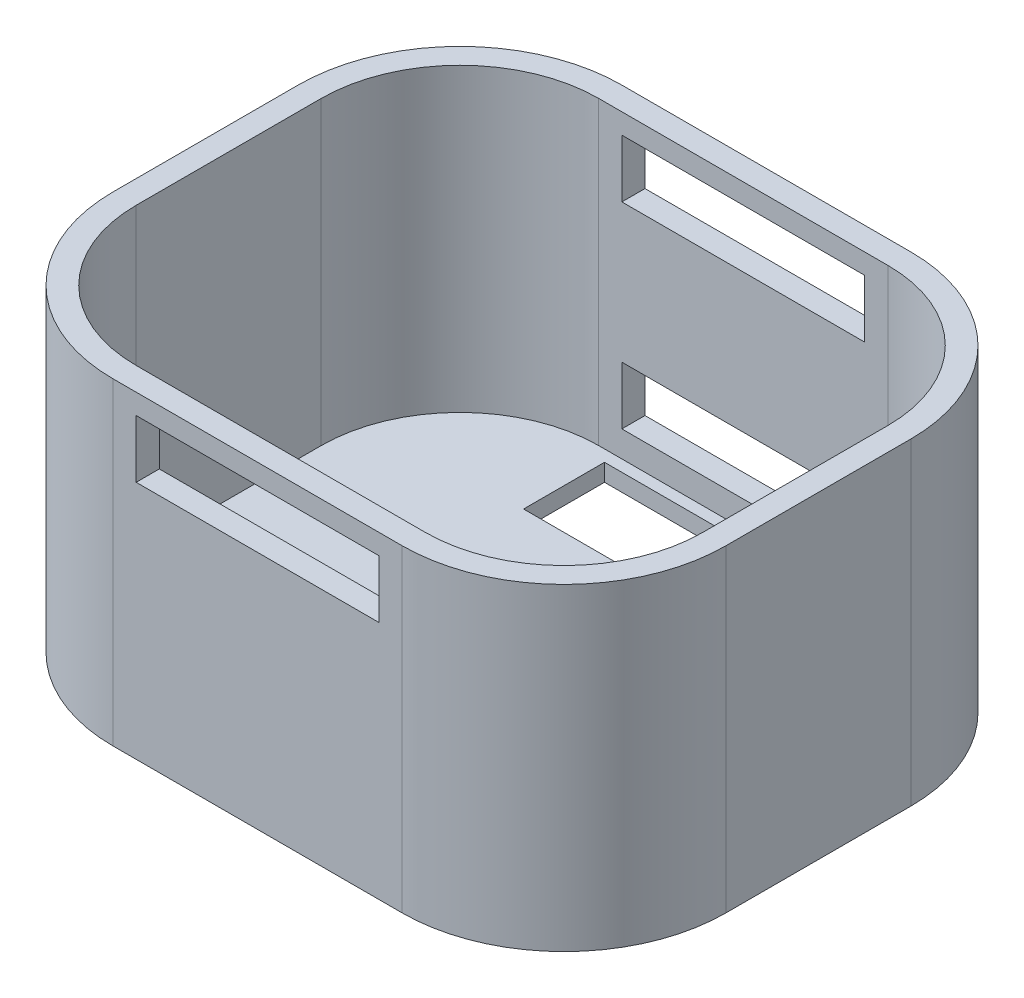
ISO-10303-21;
HEADER;
FILE_DESCRIPTION(('STEP AP214'),'2;1');
FILE_NAME('part.step','',(''),(''),'','','');
FILE_SCHEMA(('AUTOMOTIVE_DESIGN { 1 0 10303 214 1 1 1 1 }'));
ENDSEC;
DATA;
#1=APPLICATION_CONTEXT('core data for automotive mechanical design processes');
#2=APPLICATION_PROTOCOL_DEFINITION('international standard','automotive_design',2000,#1);
#3=PRODUCT_CONTEXT('',#1,'mechanical');
#4=PRODUCT('Part','Part','',(#3));
#5=PRODUCT_RELATED_PRODUCT_CATEGORY('part','',(#4));
#6=PRODUCT_DEFINITION_FORMATION('','',#4);
#7=PRODUCT_DEFINITION_CONTEXT('part definition',#1,'design');
#8=PRODUCT_DEFINITION('design','',#6,#7);
#9=PRODUCT_DEFINITION_SHAPE('','',#8);
#10=(LENGTH_UNIT() NAMED_UNIT(*) SI_UNIT(.MILLI.,.METRE.));
#11=(NAMED_UNIT(*) PLANE_ANGLE_UNIT() SI_UNIT($,.RADIAN.));
#12=(NAMED_UNIT(*) SI_UNIT($,.STERADIAN.) SOLID_ANGLE_UNIT());
#13=UNCERTAINTY_MEASURE_WITH_UNIT(LENGTH_MEASURE(1.E-05),#10,'distance_accuracy_value','');
#14=(GEOMETRIC_REPRESENTATION_CONTEXT(3) GLOBAL_UNCERTAINTY_ASSIGNED_CONTEXT((#13)) GLOBAL_UNIT_ASSIGNED_CONTEXT((#10,
#11,#12)) REPRESENTATION_CONTEXT('',''));
#15=CARTESIAN_POINT('',(0.,0.,0.));
#16=DIRECTION('',(0.,0.,1.));
#17=DIRECTION('',(1.,0.,0.));
#18=AXIS2_PLACEMENT_3D('',#15,#16,#17);
#19=CARTESIAN_POINT('',(12.5,13.75,-7.99999999999999));
#20=DIRECTION('',(0.,-1.,0.));
#21=DIRECTION('',(0.,0.,-1.));
#22=AXIS2_PLACEMENT_3D('',#19,#20,#21);
#23=CYLINDRICAL_SURFACE('',#22,12.);
#24=DIRECTION('',(0.,-1.,0.));
#25=VECTOR('',#24,1.);
#26=CARTESIAN_POINT('',(12.5,13.75,-20.));
#27=LINE('',#26,#25);
#28=CARTESIAN_POINT('',(12.5,13.75,-20.));
#29=VERTEX_POINT('',#28);
#30=CARTESIAN_POINT('',(12.5,-12.25,-20.));
#31=VERTEX_POINT('',#30);
#32=EDGE_CURVE('E417',#29,#31,#27,.T.);
#33=ORIENTED_EDGE('',*,*,#32,.T.);
#34=CARTESIAN_POINT('',(12.5,-12.25,-7.99999999999999));
#35=DIRECTION('',(0.,-1.,0.));
#36=DIRECTION('',(0.,0.,-1.));
#37=AXIS2_PLACEMENT_3D('',#34,#35,#36);
#38=CIRCLE('',#37,12.);
#39=CARTESIAN_POINT('',(24.5,-12.25,-7.99999999999999));
#40=VERTEX_POINT('',#39);
#41=EDGE_CURVE('E329',#31,#40,#38,.T.);
#42=ORIENTED_EDGE('',*,*,#41,.T.);
#43=DIRECTION('',(0.,-1.,0.));
#44=VECTOR('',#43,1.);
#45=CARTESIAN_POINT('',(24.5,13.75,-7.99999999999999));
#46=LINE('',#45,#44);
#47=CARTESIAN_POINT('',(24.5,13.75,-7.99999999999999));
#48=VERTEX_POINT('',#47);
#49=EDGE_CURVE('E396',#48,#40,#46,.T.);
#50=ORIENTED_EDGE('',*,*,#49,.F.);
#51=CARTESIAN_POINT('',(12.5,13.75,-7.99999999999999));
#52=DIRECTION('',(0.,1.,0.));
#53=DIRECTION('',(0.,0.,-1.));
#54=AXIS2_PLACEMENT_3D('',#51,#52,#53);
#55=CIRCLE('',#54,12.);
#56=EDGE_CURVE('E379',#48,#29,#55,.T.);
#57=ORIENTED_EDGE('',*,*,#56,.T.);
#58=EDGE_LOOP('',(#33,#42,#50,#57));
#59=FACE_BOUND('',#58,.T.);
#60=ADVANCED_FACE('F33',(#59),#23,.F.);
#61=CARTESIAN_POINT('',(12.5,13.75,-20.));
#62=DIRECTION('',(0.,0.,1.));
#63=DIRECTION('',(1.,0.,0.));
#64=AXIS2_PLACEMENT_3D('',#61,#62,#63);
#65=PLANE('',#64);
#66=DIRECTION('',(0.,1.,0.));
#67=VECTOR('',#66,1.);
#68=CARTESIAN_POINT('',(-10.5,-5.,-20.));
#69=LINE('',#68,#67);
#70=CARTESIAN_POINT('',(-10.5,-10.,-20.));
#71=VERTEX_POINT('',#70);
#72=CARTESIAN_POINT('',(-10.5,-5.,-20.));
#73=VERTEX_POINT('',#72);
#74=EDGE_CURVE('E280',#71,#73,#69,.T.);
#75=ORIENTED_EDGE('',*,*,#74,.T.);
#76=DIRECTION('',(1.,0.,0.));
#77=VECTOR('',#76,1.);
#78=CARTESIAN_POINT('',(10.5,-5.,-20.));
#79=LINE('',#78,#77);
#80=CARTESIAN_POINT('',(10.5,-5.,-20.));
#81=VERTEX_POINT('',#80);
#82=EDGE_CURVE('E283',#73,#81,#79,.T.);
#83=ORIENTED_EDGE('',*,*,#82,.T.);
#84=DIRECTION('',(0.,-1.,0.));
#85=VECTOR('',#84,1.);
#86=CARTESIAN_POINT('',(10.5,-5.,-20.));
#87=LINE('',#86,#85);
#88=CARTESIAN_POINT('',(10.5,-10.,-20.));
#89=VERTEX_POINT('',#88);
#90=EDGE_CURVE('E287',#81,#89,#87,.T.);
#91=ORIENTED_EDGE('',*,*,#90,.T.);
#92=DIRECTION('',(-1.,0.,0.));
#93=VECTOR('',#92,1.);
#94=CARTESIAN_POINT('',(10.5,-10.,-20.));
#95=LINE('',#94,#93);
#96=EDGE_CURVE('E290',#89,#71,#95,.T.);
#97=ORIENTED_EDGE('',*,*,#96,.T.);
#98=EDGE_LOOP('',(#75,#83,#91,#97));
#99=FACE_BOUND('',#98,.T.);
#100=DIRECTION('',(0.,1.,0.));
#101=VECTOR('',#100,1.);
#102=CARTESIAN_POINT('',(10.5,13.75,-20.));
#103=LINE('',#102,#101);
#104=CARTESIAN_POINT('',(10.5,7.,-20.));
#105=VERTEX_POINT('',#104);
#106=CARTESIAN_POINT('',(10.5,12.,-20.));
#107=VERTEX_POINT('',#106);
#108=EDGE_CURVE('E376',#105,#107,#103,.T.);
#109=ORIENTED_EDGE('',*,*,#108,.F.);
#110=DIRECTION('',(1.,0.,0.));
#111=VECTOR('',#110,1.);
#112=CARTESIAN_POINT('',(12.5,7.,-20.));
#113=LINE('',#112,#111);
#114=CARTESIAN_POINT('',(-10.5,7.,-20.));
#115=VERTEX_POINT('',#114);
#116=EDGE_CURVE('E374',#115,#105,#113,.T.);
#117=ORIENTED_EDGE('',*,*,#116,.F.);
#118=DIRECTION('',(0.,-1.,0.));
#119=VECTOR('',#118,1.);
#120=CARTESIAN_POINT('',(-10.5,13.75,-20.));
#121=LINE('',#120,#119);
#122=CARTESIAN_POINT('',(-10.5,12.,-20.));
#123=VERTEX_POINT('',#122);
#124=EDGE_CURVE('E372',#123,#115,#121,.T.);
#125=ORIENTED_EDGE('',*,*,#124,.F.);
#126=DIRECTION('',(-1.,0.,0.));
#127=VECTOR('',#126,1.);
#128=CARTESIAN_POINT('',(12.5,12.,-20.));
#129=LINE('',#128,#127);
#130=EDGE_CURVE('E359',#107,#123,#129,.T.);
#131=ORIENTED_EDGE('',*,*,#130,.F.);
#132=EDGE_LOOP('',(#109,#117,#125,#131));
#133=FACE_BOUND('',#132,.T.);
#134=DIRECTION('',(0.,-1.,0.));
#135=VECTOR('',#134,1.);
#136=CARTESIAN_POINT('',(-12.5,13.75,-20.));
#137=LINE('',#136,#135);
#138=CARTESIAN_POINT('',(-12.5,13.75,-20.));
#139=VERTEX_POINT('',#138);
#140=CARTESIAN_POINT('',(-12.5,-12.25,-20.));
#141=VERTEX_POINT('',#140);
#142=EDGE_CURVE('E414',#139,#141,#137,.T.);
#143=ORIENTED_EDGE('',*,*,#142,.T.);
#144=DIRECTION('',(1.,0.,0.));
#145=VECTOR('',#144,1.);
#146=CARTESIAN_POINT('',(12.5,-12.25,-20.));
#147=LINE('',#146,#145);
#148=EDGE_CURVE('E326',#141,#31,#147,.T.);
#149=ORIENTED_EDGE('',*,*,#148,.T.);
#150=ORIENTED_EDGE('',*,*,#32,.F.);
#151=DIRECTION('',(-1.,0.,0.));
#152=VECTOR('',#151,1.);
#153=CARTESIAN_POINT('',(12.5,13.75,-20.));
#154=LINE('',#153,#152);
#155=EDGE_CURVE('E381',#29,#139,#154,.T.);
#156=ORIENTED_EDGE('',*,*,#155,.T.);
#157=EDGE_LOOP('',(#143,#149,#150,#156));
#158=FACE_BOUND('',#157,.T.);
#159=ADVANCED_FACE('F525',(#99,#133,#158),#65,.T.);
#160=CARTESIAN_POINT('',(-12.5,13.75,-7.99999999999999));
#161=DIRECTION('',(0.,-1.,0.));
#162=DIRECTION('',(0.,0.,-1.));
#163=AXIS2_PLACEMENT_3D('',#160,#161,#162);
#164=CYLINDRICAL_SURFACE('',#163,12.);
#165=DIRECTION('',(0.,-1.,0.));
#166=VECTOR('',#165,1.);
#167=CARTESIAN_POINT('',(-24.5,13.75,-7.99999999999999));
#168=LINE('',#167,#166);
#169=CARTESIAN_POINT('',(-24.5,13.75,-7.99999999999999));
#170=VERTEX_POINT('',#169);
#171=CARTESIAN_POINT('',(-24.5,-12.25,-7.99999999999999));
#172=VERTEX_POINT('',#171);
#173=EDGE_CURVE('E411',#170,#172,#168,.T.);
#174=ORIENTED_EDGE('',*,*,#173,.T.);
#175=CARTESIAN_POINT('',(-12.5,-12.25,-7.99999999999999));
#176=DIRECTION('',(0.,-1.,0.));
#177=DIRECTION('',(0.,0.,-1.));
#178=AXIS2_PLACEMENT_3D('',#175,#176,#177);
#179=CIRCLE('',#178,12.);
#180=EDGE_CURVE('E323',#172,#141,#179,.T.);
#181=ORIENTED_EDGE('',*,*,#180,.T.);
#182=ORIENTED_EDGE('',*,*,#142,.F.);
#183=CARTESIAN_POINT('',(-12.5,13.75,-7.99999999999999));
#184=DIRECTION('',(0.,1.,0.));
#185=DIRECTION('',(0.,0.,-1.));
#186=AXIS2_PLACEMENT_3D('',#183,#184,#185);
#187=CIRCLE('',#186,12.);
#188=EDGE_CURVE('E383',#139,#170,#187,.T.);
#189=ORIENTED_EDGE('',*,*,#188,.T.);
#190=EDGE_LOOP('',(#174,#181,#182,#189));
#191=FACE_BOUND('',#190,.T.);
#192=ADVANCED_FACE('F531',(#191),#164,.F.);
#193=CARTESIAN_POINT('',(-24.5,13.75,8.00000000000001));
#194=DIRECTION('',(1.,0.,0.));
#195=DIRECTION('',(0.,0.,-1.));
#196=AXIS2_PLACEMENT_3D('',#193,#194,#195);
#197=PLANE('',#196);
#198=DIRECTION('',(0.,-1.,0.));
#199=VECTOR('',#198,1.);
#200=CARTESIAN_POINT('',(-24.5,13.75,8.00000000000001));
#201=LINE('',#200,#199);
#202=CARTESIAN_POINT('',(-24.5,13.75,8.00000000000001));
#203=VERTEX_POINT('',#202);
#204=CARTESIAN_POINT('',(-24.5,-12.25,8.00000000000001));
#205=VERTEX_POINT('',#204);
#206=EDGE_CURVE('E408',#203,#205,#201,.T.);
#207=ORIENTED_EDGE('',*,*,#206,.T.);
#208=DIRECTION('',(0.,0.,-1.));
#209=VECTOR('',#208,1.);
#210=CARTESIAN_POINT('',(-24.5,-12.25,8.00000000000001));
#211=LINE('',#210,#209);
#212=EDGE_CURVE('E320',#205,#172,#211,.T.);
#213=ORIENTED_EDGE('',*,*,#212,.T.);
#214=ORIENTED_EDGE('',*,*,#173,.F.);
#215=DIRECTION('',(0.,0.,1.));
#216=VECTOR('',#215,1.);
#217=CARTESIAN_POINT('',(-24.5,13.75,8.00000000000001));
#218=LINE('',#217,#216);
#219=EDGE_CURVE('E385',#170,#203,#218,.T.);
#220=ORIENTED_EDGE('',*,*,#219,.T.);
#221=EDGE_LOOP('',(#207,#213,#214,#220));
#222=FACE_BOUND('',#221,.T.);
#223=ADVANCED_FACE('F623',(#222),#197,.T.);
#224=CARTESIAN_POINT('',(-12.5,13.75,8.00000000000001));
#225=DIRECTION('',(0.,-1.,0.));
#226=DIRECTION('',(0.,0.,-1.));
#227=AXIS2_PLACEMENT_3D('',#224,#225,#226);
#228=CYLINDRICAL_SURFACE('',#227,12.);
#229=DIRECTION('',(0.,-1.,0.));
#230=VECTOR('',#229,1.);
#231=CARTESIAN_POINT('',(-12.5,13.75,20.));
#232=LINE('',#231,#230);
#233=CARTESIAN_POINT('',(-12.5,13.75,20.));
#234=VERTEX_POINT('',#233);
#235=CARTESIAN_POINT('',(-12.5,-12.25,20.));
#236=VERTEX_POINT('',#235);
#237=EDGE_CURVE('E405',#234,#236,#232,.T.);
#238=ORIENTED_EDGE('',*,*,#237,.T.);
#239=CARTESIAN_POINT('',(-12.5,-12.25,8.00000000000001));
#240=DIRECTION('',(0.,-1.,0.));
#241=DIRECTION('',(0.,0.,-1.));
#242=AXIS2_PLACEMENT_3D('',#239,#240,#241);
#243=CIRCLE('',#242,12.);
#244=EDGE_CURVE('E317',#236,#205,#243,.T.);
#245=ORIENTED_EDGE('',*,*,#244,.T.);
#246=ORIENTED_EDGE('',*,*,#206,.F.);
#247=CARTESIAN_POINT('',(-12.5,13.75,8.00000000000001));
#248=DIRECTION('',(0.,1.,0.));
#249=DIRECTION('',(0.,0.,-1.));
#250=AXIS2_PLACEMENT_3D('',#247,#248,#249);
#251=CIRCLE('',#250,12.);
#252=EDGE_CURVE('E387',#203,#234,#251,.T.);
#253=ORIENTED_EDGE('',*,*,#252,.T.);
#254=EDGE_LOOP('',(#238,#245,#246,#253));
#255=FACE_BOUND('',#254,.T.);
#256=ADVANCED_FACE('F625',(#255),#228,.F.);
#257=CARTESIAN_POINT('',(12.5,13.75,20.));
#258=DIRECTION('',(0.,0.,-1.));
#259=DIRECTION('',(-1.,0.,0.));
#260=AXIS2_PLACEMENT_3D('',#257,#258,#259);
#261=PLANE('',#260);
#262=DIRECTION('',(0.,-1.,0.));
#263=VECTOR('',#262,1.);
#264=CARTESIAN_POINT('',(10.5,13.75,20.));
#265=LINE('',#264,#263);
#266=CARTESIAN_POINT('',(10.5,12.,20.));
#267=VERTEX_POINT('',#266);
#268=CARTESIAN_POINT('',(10.5,7.,20.));
#269=VERTEX_POINT('',#268);
#270=EDGE_CURVE('E41',#267,#269,#265,.T.);
#271=ORIENTED_EDGE('',*,*,#270,.F.);
#272=DIRECTION('',(1.,0.,0.));
#273=VECTOR('',#272,1.);
#274=CARTESIAN_POINT('',(12.5,12.,20.));
#275=LINE('',#274,#273);
#276=CARTESIAN_POINT('',(-10.5,12.,20.));
#277=VERTEX_POINT('',#276);
#278=EDGE_CURVE('E477',#277,#267,#275,.T.);
#279=ORIENTED_EDGE('',*,*,#278,.F.);
#280=DIRECTION('',(0.,1.,0.));
#281=VECTOR('',#280,1.);
#282=CARTESIAN_POINT('',(-10.5,13.75,20.));
#283=LINE('',#282,#281);
#284=CARTESIAN_POINT('',(-10.5,7.,20.));
#285=VERTEX_POINT('',#284);
#286=EDGE_CURVE('E479',#285,#277,#283,.T.);
#287=ORIENTED_EDGE('',*,*,#286,.F.);
#288=DIRECTION('',(-1.,0.,0.));
#289=VECTOR('',#288,1.);
#290=CARTESIAN_POINT('',(12.5,7.,20.));
#291=LINE('',#290,#289);
#292=EDGE_CURVE('E482',#269,#285,#291,.T.);
#293=ORIENTED_EDGE('',*,*,#292,.F.);
#294=EDGE_LOOP('',(#271,#279,#287,#293));
#295=FACE_BOUND('',#294,.T.);
#296=DIRECTION('',(0.,-1.,0.));
#297=VECTOR('',#296,1.);
#298=CARTESIAN_POINT('',(12.5,13.75,20.));
#299=LINE('',#298,#297);
#300=CARTESIAN_POINT('',(12.5,13.75,20.));
#301=VERTEX_POINT('',#300);
#302=CARTESIAN_POINT('',(12.5,-12.25,20.));
#303=VERTEX_POINT('',#302);
#304=EDGE_CURVE('E402',#301,#303,#299,.T.);
#305=ORIENTED_EDGE('',*,*,#304,.T.);
#306=DIRECTION('',(-1.,0.,0.));
#307=VECTOR('',#306,1.);
#308=CARTESIAN_POINT('',(12.5,-12.25,20.));
#309=LINE('',#308,#307);
#310=EDGE_CURVE('E314',#303,#236,#309,.T.);
#311=ORIENTED_EDGE('',*,*,#310,.T.);
#312=ORIENTED_EDGE('',*,*,#237,.F.);
#313=DIRECTION('',(1.,0.,0.));
#314=VECTOR('',#313,1.);
#315=CARTESIAN_POINT('',(12.5,13.75,20.));
#316=LINE('',#315,#314);
#317=EDGE_CURVE('E389',#234,#301,#316,.T.);
#318=ORIENTED_EDGE('',*,*,#317,.T.);
#319=EDGE_LOOP('',(#305,#311,#312,#318));
#320=FACE_BOUND('',#319,.T.);
#321=ADVANCED_FACE('F498',(#295,#320),#261,.T.);
#322=CARTESIAN_POINT('',(12.5,13.75,8.00000000000001));
#323=DIRECTION('',(0.,-1.,0.));
#324=DIRECTION('',(0.,0.,-1.));
#325=AXIS2_PLACEMENT_3D('',#322,#323,#324);
#326=CYLINDRICAL_SURFACE('',#325,12.);
#327=DIRECTION('',(0.,-1.,0.));
#328=VECTOR('',#327,1.);
#329=CARTESIAN_POINT('',(24.5,13.75,8.00000000000001));
#330=LINE('',#329,#328);
#331=CARTESIAN_POINT('',(24.5,13.75,8.));
#332=VERTEX_POINT('',#331);
#333=CARTESIAN_POINT('',(24.5,-12.25,8.00000000000001));
#334=VERTEX_POINT('',#333);
#335=EDGE_CURVE('E399',#332,#334,#330,.T.);
#336=ORIENTED_EDGE('',*,*,#335,.T.);
#337=CARTESIAN_POINT('',(12.5,-12.25,8.00000000000001));
#338=DIRECTION('',(0.,-1.,0.));
#339=DIRECTION('',(0.,0.,-1.));
#340=AXIS2_PLACEMENT_3D('',#337,#338,#339);
#341=CIRCLE('',#340,12.);
#342=EDGE_CURVE('E305',#334,#303,#341,.T.);
#343=ORIENTED_EDGE('',*,*,#342,.T.);
#344=ORIENTED_EDGE('',*,*,#304,.F.);
#345=CARTESIAN_POINT('',(12.5,13.75,8.00000000000001));
#346=DIRECTION('',(0.,1.,0.));
#347=DIRECTION('',(0.,0.,-1.));
#348=AXIS2_PLACEMENT_3D('',#345,#346,#347);
#349=CIRCLE('',#348,12.);
#350=EDGE_CURVE('E391',#301,#332,#349,.T.);
#351=ORIENTED_EDGE('',*,*,#350,.T.);
#352=EDGE_LOOP('',(#336,#343,#344,#351));
#353=FACE_BOUND('',#352,.T.);
#354=ADVANCED_FACE('F630',(#353),#326,.F.);
#355=CARTESIAN_POINT('',(24.5,13.75,8.00000000000001));
#356=DIRECTION('',(-1.,0.,0.));
#357=DIRECTION('',(0.,0.,1.));
#358=AXIS2_PLACEMENT_3D('',#355,#356,#357);
#359=PLANE('',#358);
#360=ORIENTED_EDGE('',*,*,#49,.T.);
#361=DIRECTION('',(0.,0.,1.));
#362=VECTOR('',#361,1.);
#363=CARTESIAN_POINT('',(24.5,-12.25,8.00000000000001));
#364=LINE('',#363,#362);
#365=EDGE_CURVE('E11',#40,#334,#364,.T.);
#366=ORIENTED_EDGE('',*,*,#365,.T.);
#367=ORIENTED_EDGE('',*,*,#335,.F.);
#368=DIRECTION('',(0.,0.,-1.));
#369=VECTOR('',#368,1.);
#370=CARTESIAN_POINT('',(24.5,13.75,8.00000000000001));
#371=LINE('',#370,#369);
#372=EDGE_CURVE('E394',#332,#48,#371,.T.);
#373=ORIENTED_EDGE('',*,*,#372,.T.);
#374=EDGE_LOOP('',(#360,#366,#367,#373));
#375=FACE_BOUND('',#374,.T.);
#376=ADVANCED_FACE('F540',(#375),#359,.T.);
#377=CARTESIAN_POINT('',(-12.5,13.75,-7.99999999999999));
#378=DIRECTION('',(0.,1.,0.));
#379=DIRECTION('',(0.,0.,1.));
#380=AXIS2_PLACEMENT_3D('',#377,#378,#379);
#381=PLANE('',#380);
#382=CARTESIAN_POINT('',(-12.5,13.75,-7.99999999999999));
#383=DIRECTION('',(0.,1.,0.));
#384=DIRECTION('',(0.,0.,1.));
#385=AXIS2_PLACEMENT_3D('',#382,#383,#384);
#386=CIRCLE('',#385,14.);
#387=CARTESIAN_POINT('',(-12.5,13.75,-22.));
#388=VERTEX_POINT('',#387);
#389=CARTESIAN_POINT('',(-26.5,13.75,-7.99999999999998));
#390=VERTEX_POINT('',#389);
#391=EDGE_CURVE('E421',#388,#390,#386,.T.);
#392=ORIENTED_EDGE('',*,*,#391,.T.);
#393=DIRECTION('',(0.,0.,1.));
#394=VECTOR('',#393,1.);
#395=CARTESIAN_POINT('',(-26.5,13.75,-7.99999999999998));
#396=LINE('',#395,#394);
#397=CARTESIAN_POINT('',(-26.5,13.75,7.99999999999998));
#398=VERTEX_POINT('',#397);
#399=EDGE_CURVE('E424',#390,#398,#396,.T.);
#400=ORIENTED_EDGE('',*,*,#399,.T.);
#401=CARTESIAN_POINT('',(-12.5,13.75,7.99999999999998));
#402=DIRECTION('',(0.,1.,0.));
#403=DIRECTION('',(0.,0.,1.));
#404=AXIS2_PLACEMENT_3D('',#401,#402,#403);
#405=CIRCLE('',#404,14.);
#406=CARTESIAN_POINT('',(-12.5,13.75,22.));
#407=VERTEX_POINT('',#406);
#408=EDGE_CURVE('E427',#398,#407,#405,.T.);
#409=ORIENTED_EDGE('',*,*,#408,.T.);
#410=DIRECTION('',(1.,0.,0.));
#411=VECTOR('',#410,1.);
#412=CARTESIAN_POINT('',(-12.5,13.75,22.));
#413=LINE('',#412,#411);
#414=CARTESIAN_POINT('',(12.5,13.75,22.));
#415=VERTEX_POINT('',#414);
#416=EDGE_CURVE('E429',#407,#415,#413,.T.);
#417=ORIENTED_EDGE('',*,*,#416,.T.);
#418=CARTESIAN_POINT('',(12.5,13.75,7.99999999999999));
#419=DIRECTION('',(0.,1.,0.));
#420=DIRECTION('',(0.,0.,1.));
#421=AXIS2_PLACEMENT_3D('',#418,#419,#420);
#422=CIRCLE('',#421,14.);
#423=CARTESIAN_POINT('',(26.5,13.75,8.));
#424=VERTEX_POINT('',#423);
#425=EDGE_CURVE('E431',#415,#424,#422,.T.);
#426=ORIENTED_EDGE('',*,*,#425,.T.);
#427=DIRECTION('',(0.,0.,-1.));
#428=VECTOR('',#427,1.);
#429=CARTESIAN_POINT('',(26.5,13.75,8.));
#430=LINE('',#429,#428);
#431=CARTESIAN_POINT('',(26.5,13.75,-7.99999999999999));
#432=VERTEX_POINT('',#431);
#433=EDGE_CURVE('E433',#424,#432,#430,.T.);
#434=ORIENTED_EDGE('',*,*,#433,.T.);
#435=CARTESIAN_POINT('',(12.5,13.75,-7.99999999999999));
#436=DIRECTION('',(0.,1.,0.));
#437=DIRECTION('',(0.,0.,1.));
#438=AXIS2_PLACEMENT_3D('',#435,#436,#437);
#439=CIRCLE('',#438,14.);
#440=CARTESIAN_POINT('',(12.5,13.75,-22.));
#441=VERTEX_POINT('',#440);
#442=EDGE_CURVE('E435',#432,#441,#439,.T.);
#443=ORIENTED_EDGE('',*,*,#442,.T.);
#444=DIRECTION('',(-1.,0.,0.));
#445=VECTOR('',#444,1.);
#446=CARTESIAN_POINT('',(12.5,13.75,-22.));
#447=LINE('',#446,#445);
#448=EDGE_CURVE('E437',#441,#388,#447,.T.);
#449=ORIENTED_EDGE('',*,*,#448,.T.);
#450=EDGE_LOOP('',(#392,#400,#409,#417,#426,#434,#443,#449));
#451=FACE_BOUND('',#450,.T.);
#452=ORIENTED_EDGE('',*,*,#155,.F.);
#453=ORIENTED_EDGE('',*,*,#56,.F.);
#454=ORIENTED_EDGE('',*,*,#372,.F.);
#455=ORIENTED_EDGE('',*,*,#350,.F.);
#456=ORIENTED_EDGE('',*,*,#317,.F.);
#457=ORIENTED_EDGE('',*,*,#252,.F.);
#458=ORIENTED_EDGE('',*,*,#219,.F.);
#459=ORIENTED_EDGE('',*,*,#188,.F.);
#460=EDGE_LOOP('',(#452,#453,#454,#455,#456,#457,#458,#459));
#461=FACE_BOUND('',#460,.T.);
#462=ADVANCED_FACE('F536',(#451,#461),#381,.T.);
#463=CARTESIAN_POINT('',(-12.5,-13.75,-7.99999999999999));
#464=DIRECTION('',(0.,1.,0.));
#465=DIRECTION('',(0.,0.,1.));
#466=AXIS2_PLACEMENT_3D('',#463,#464,#465);
#467=PLANE('',#466);
#468=DIRECTION('',(1.,0.,0.));
#469=VECTOR('',#468,1.);
#470=CARTESIAN_POINT('',(-12.5,-13.75,-12.));
#471=LINE('',#470,#469);
#472=CARTESIAN_POINT('',(-11.,-13.75,-12.));
#473=VERTEX_POINT('',#472);
#474=CARTESIAN_POINT('',(11.,-13.75,-12.));
#475=VERTEX_POINT('',#474);
#476=EDGE_CURVE('E273',#473,#475,#471,.T.);
#477=ORIENTED_EDGE('',*,*,#476,.T.);
#478=DIRECTION('',(0.,0.,-1.));
#479=VECTOR('',#478,1.);
#480=CARTESIAN_POINT('',(11.,-13.75,-7.99999999999999));
#481=LINE('',#480,#479);
#482=CARTESIAN_POINT('',(11.,-13.75,-19.));
#483=VERTEX_POINT('',#482);
#484=EDGE_CURVE('E276',#475,#483,#481,.T.);
#485=ORIENTED_EDGE('',*,*,#484,.T.);
#486=DIRECTION('',(-1.,0.,0.));
#487=VECTOR('',#486,1.);
#488=CARTESIAN_POINT('',(-12.5,-13.75,-19.));
#489=LINE('',#488,#487);
#490=CARTESIAN_POINT('',(-11.,-13.75,-19.));
#491=VERTEX_POINT('',#490);
#492=EDGE_CURVE('E268',#483,#491,#489,.T.);
#493=ORIENTED_EDGE('',*,*,#492,.T.);
#494=DIRECTION('',(0.,0.,1.));
#495=VECTOR('',#494,1.);
#496=CARTESIAN_POINT('',(-11.,-13.75,-7.99999999999999));
#497=LINE('',#496,#495);
#498=EDGE_CURVE('E248',#491,#473,#497,.T.);
#499=ORIENTED_EDGE('',*,*,#498,.T.);
#500=EDGE_LOOP('',(#477,#485,#493,#499));
#501=FACE_BOUND('',#500,.T.);
#502=CARTESIAN_POINT('',(-12.5,-13.75,-7.99999999999999));
#503=DIRECTION('',(0.,1.,0.));
#504=DIRECTION('',(0.,0.,1.));
#505=AXIS2_PLACEMENT_3D('',#502,#503,#504);
#506=CIRCLE('',#505,14.);
#507=CARTESIAN_POINT('',(-12.5,-13.75,-22.));
#508=VERTEX_POINT('',#507);
#509=CARTESIAN_POINT('',(-26.5,-13.75,-7.99999999999998));
#510=VERTEX_POINT('',#509);
#511=EDGE_CURVE('E420',#508,#510,#506,.T.);
#512=ORIENTED_EDGE('',*,*,#511,.F.);
#513=DIRECTION('',(-1.,0.,0.));
#514=VECTOR('',#513,1.);
#515=CARTESIAN_POINT('',(12.5,-13.75,-22.));
#516=LINE('',#515,#514);
#517=CARTESIAN_POINT('',(12.5,-13.75,-22.));
#518=VERTEX_POINT('',#517);
#519=EDGE_CURVE('E425',#518,#508,#516,.T.);
#520=ORIENTED_EDGE('',*,*,#519,.F.);
#521=CARTESIAN_POINT('',(12.5,-13.75,-7.99999999999999));
#522=DIRECTION('',(0.,1.,0.));
#523=DIRECTION('',(0.,0.,1.));
#524=AXIS2_PLACEMENT_3D('',#521,#522,#523);
#525=CIRCLE('',#524,14.);
#526=CARTESIAN_POINT('',(26.5,-13.75,-7.99999999999999));
#527=VERTEX_POINT('',#526);
#528=EDGE_CURVE('E457',#527,#518,#525,.T.);
#529=ORIENTED_EDGE('',*,*,#528,.F.);
#530=DIRECTION('',(0.,0.,-1.));
#531=VECTOR('',#530,1.);
#532=CARTESIAN_POINT('',(26.5,-13.75,8.));
#533=LINE('',#532,#531);
#534=CARTESIAN_POINT('',(26.5,-13.75,8.));
#535=VERTEX_POINT('',#534);
#536=EDGE_CURVE('E454',#535,#527,#533,.T.);
#537=ORIENTED_EDGE('',*,*,#536,.F.);
#538=CARTESIAN_POINT('',(12.5,-13.75,7.99999999999999));
#539=DIRECTION('',(0.,1.,0.));
#540=DIRECTION('',(0.,0.,1.));
#541=AXIS2_PLACEMENT_3D('',#538,#539,#540);
#542=CIRCLE('',#541,14.);
#543=CARTESIAN_POINT('',(12.5,-13.75,22.));
#544=VERTEX_POINT('',#543);
#545=EDGE_CURVE('E451',#544,#535,#542,.T.);
#546=ORIENTED_EDGE('',*,*,#545,.F.);
#547=DIRECTION('',(1.,0.,0.));
#548=VECTOR('',#547,1.);
#549=CARTESIAN_POINT('',(-12.5,-13.75,22.));
#550=LINE('',#549,#548);
#551=CARTESIAN_POINT('',(-12.5,-13.75,22.));
#552=VERTEX_POINT('',#551);
#553=EDGE_CURVE('E448',#552,#544,#550,.T.);
#554=ORIENTED_EDGE('',*,*,#553,.F.);
#555=CARTESIAN_POINT('',(-12.5,-13.75,7.99999999999998));
#556=DIRECTION('',(0.,1.,0.));
#557=DIRECTION('',(0.,0.,1.));
#558=AXIS2_PLACEMENT_3D('',#555,#556,#557);
#559=CIRCLE('',#558,14.);
#560=CARTESIAN_POINT('',(-26.5,-13.75,7.99999999999998));
#561=VERTEX_POINT('',#560);
#562=EDGE_CURVE('E445',#561,#552,#559,.T.);
#563=ORIENTED_EDGE('',*,*,#562,.F.);
#564=DIRECTION('',(0.,0.,1.));
#565=VECTOR('',#564,1.);
#566=CARTESIAN_POINT('',(-26.5,-13.75,-7.99999999999998));
#567=LINE('',#566,#565);
#568=EDGE_CURVE('E442',#510,#561,#567,.T.);
#569=ORIENTED_EDGE('',*,*,#568,.F.);
#570=EDGE_LOOP('',(#512,#520,#529,#537,#546,#554,#563,#569));
#571=FACE_BOUND('',#570,.T.);
#572=ADVANCED_FACE('F539',(#501,#571),#467,.F.);
#573=CARTESIAN_POINT('',(-12.5,13.75,-7.99999999999999));
#574=DIRECTION('',(0.,-1.,0.));
#575=DIRECTION('',(0.,0.,-1.));
#576=AXIS2_PLACEMENT_3D('',#573,#574,#575);
#577=CYLINDRICAL_SURFACE('',#576,14.);
#578=ORIENTED_EDGE('',*,*,#511,.T.);
#579=DIRECTION('',(0.,-1.,0.));
#580=VECTOR('',#579,1.);
#581=CARTESIAN_POINT('',(-26.5,13.75,-7.99999999999998));
#582=LINE('',#581,#580);
#583=EDGE_CURVE('E475',#390,#510,#582,.T.);
#584=ORIENTED_EDGE('',*,*,#583,.F.);
#585=ORIENTED_EDGE('',*,*,#391,.F.);
#586=DIRECTION('',(0.,-1.,0.));
#587=VECTOR('',#586,1.);
#588=CARTESIAN_POINT('',(-12.5,13.75,-22.));
#589=LINE('',#588,#587);
#590=EDGE_CURVE('E439',#388,#508,#589,.T.);
#591=ORIENTED_EDGE('',*,*,#590,.T.);
#592=EDGE_LOOP('',(#578,#584,#585,#591));
#593=FACE_BOUND('',#592,.T.);
#594=ADVANCED_FACE('F35',(#593),#577,.T.);
#595=CARTESIAN_POINT('',(-26.5,13.75,-7.99999999999998));
#596=DIRECTION('',(1.,0.,0.));
#597=DIRECTION('',(0.,0.,-1.));
#598=AXIS2_PLACEMENT_3D('',#595,#596,#597);
#599=PLANE('',#598);
#600=ORIENTED_EDGE('',*,*,#568,.T.);
#601=DIRECTION('',(0.,-1.,0.));
#602=VECTOR('',#601,1.);
#603=CARTESIAN_POINT('',(-26.5,13.75,7.99999999999998));
#604=LINE('',#603,#602);
#605=EDGE_CURVE('E473',#398,#561,#604,.T.);
#606=ORIENTED_EDGE('',*,*,#605,.F.);
#607=ORIENTED_EDGE('',*,*,#399,.F.);
#608=ORIENTED_EDGE('',*,*,#583,.T.);
#609=EDGE_LOOP('',(#600,#606,#607,#608));
#610=FACE_BOUND('',#609,.T.);
#611=ADVANCED_FACE('F561',(#610),#599,.F.);
#612=CARTESIAN_POINT('',(-12.5,13.75,7.99999999999998));
#613=DIRECTION('',(0.,-1.,0.));
#614=DIRECTION('',(0.,0.,-1.));
#615=AXIS2_PLACEMENT_3D('',#612,#613,#614);
#616=CYLINDRICAL_SURFACE('',#615,14.);
#617=ORIENTED_EDGE('',*,*,#562,.T.);
#618=DIRECTION('',(0.,-1.,0.));
#619=VECTOR('',#618,1.);
#620=CARTESIAN_POINT('',(-12.5,13.75,22.));
#621=LINE('',#620,#619);
#622=EDGE_CURVE('E471',#407,#552,#621,.T.);
#623=ORIENTED_EDGE('',*,*,#622,.F.);
#624=ORIENTED_EDGE('',*,*,#408,.F.);
#625=ORIENTED_EDGE('',*,*,#605,.T.);
#626=EDGE_LOOP('',(#617,#623,#624,#625));
#627=FACE_BOUND('',#626,.T.);
#628=ADVANCED_FACE('F558',(#627),#616,.T.);
#629=CARTESIAN_POINT('',(-12.5,13.75,22.));
#630=DIRECTION('',(0.,0.,-1.));
#631=DIRECTION('',(-1.,0.,0.));
#632=AXIS2_PLACEMENT_3D('',#629,#630,#631);
#633=PLANE('',#632);
#634=ORIENTED_EDGE('',*,*,#553,.T.);
#635=DIRECTION('',(0.,-1.,0.));
#636=VECTOR('',#635,1.);
#637=CARTESIAN_POINT('',(12.5,13.75,22.));
#638=LINE('',#637,#636);
#639=EDGE_CURVE('E469',#415,#544,#638,.T.);
#640=ORIENTED_EDGE('',*,*,#639,.F.);
#641=ORIENTED_EDGE('',*,*,#416,.F.);
#642=ORIENTED_EDGE('',*,*,#622,.T.);
#643=EDGE_LOOP('',(#634,#640,#641,#642));
#644=FACE_BOUND('',#643,.T.);
#645=DIRECTION('',(-1.,0.,0.));
#646=VECTOR('',#645,1.);
#647=CARTESIAN_POINT('',(-10.5,12.,22.));
#648=LINE('',#647,#646);
#649=CARTESIAN_POINT('',(10.5,12.,22.));
#650=VERTEX_POINT('',#649);
#651=CARTESIAN_POINT('',(-10.5,12.,22.));
#652=VERTEX_POINT('',#651);
#653=EDGE_CURVE('E334',#650,#652,#648,.T.);
#654=ORIENTED_EDGE('',*,*,#653,.F.);
#655=DIRECTION('',(0.,1.,0.));
#656=VECTOR('',#655,1.);
#657=CARTESIAN_POINT('',(10.5,12.,22.));
#658=LINE('',#657,#656);
#659=CARTESIAN_POINT('',(10.5,7.,22.));
#660=VERTEX_POINT('',#659);
#661=EDGE_CURVE('E332',#660,#650,#658,.T.);
#662=ORIENTED_EDGE('',*,*,#661,.F.);
#663=DIRECTION('',(1.,0.,0.));
#664=VECTOR('',#663,1.);
#665=CARTESIAN_POINT('',(-10.5,7.,22.));
#666=LINE('',#665,#664);
#667=CARTESIAN_POINT('',(-10.5,7.,22.));
#668=VERTEX_POINT('',#667);
#669=EDGE_CURVE('E340',#668,#660,#666,.T.);
#670=ORIENTED_EDGE('',*,*,#669,.F.);
#671=DIRECTION('',(0.,-1.,0.));
#672=VECTOR('',#671,1.);
#673=CARTESIAN_POINT('',(-10.5,12.,22.));
#674=LINE('',#673,#672);
#675=EDGE_CURVE('E337',#652,#668,#674,.T.);
#676=ORIENTED_EDGE('',*,*,#675,.F.);
#677=EDGE_LOOP('',(#654,#662,#670,#676));
#678=FACE_BOUND('',#677,.T.);
#679=ADVANCED_FACE('F505',(#644,#678),#633,.F.);
#680=CARTESIAN_POINT('',(12.5,13.75,7.99999999999999));
#681=DIRECTION('',(0.,-1.,0.));
#682=DIRECTION('',(0.,0.,-1.));
#683=AXIS2_PLACEMENT_3D('',#680,#681,#682);
#684=CYLINDRICAL_SURFACE('',#683,14.);
#685=ORIENTED_EDGE('',*,*,#545,.T.);
#686=DIRECTION('',(0.,-1.,0.));
#687=VECTOR('',#686,1.);
#688=CARTESIAN_POINT('',(26.5,13.75,8.));
#689=LINE('',#688,#687);
#690=EDGE_CURVE('E467',#424,#535,#689,.T.);
#691=ORIENTED_EDGE('',*,*,#690,.F.);
#692=ORIENTED_EDGE('',*,*,#425,.F.);
#693=ORIENTED_EDGE('',*,*,#639,.T.);
#694=EDGE_LOOP('',(#685,#691,#692,#693));
#695=FACE_BOUND('',#694,.T.);
#696=ADVANCED_FACE('F551',(#695),#684,.T.);
#697=CARTESIAN_POINT('',(26.5,13.75,8.));
#698=DIRECTION('',(-1.,0.,0.));
#699=DIRECTION('',(0.,0.,1.));
#700=AXIS2_PLACEMENT_3D('',#697,#698,#699);
#701=PLANE('',#700);
#702=ORIENTED_EDGE('',*,*,#536,.T.);
#703=DIRECTION('',(0.,-1.,0.));
#704=VECTOR('',#703,1.);
#705=CARTESIAN_POINT('',(26.5,13.75,-7.99999999999999));
#706=LINE('',#705,#704);
#707=EDGE_CURVE('E465',#432,#527,#706,.T.);
#708=ORIENTED_EDGE('',*,*,#707,.F.);
#709=ORIENTED_EDGE('',*,*,#433,.F.);
#710=ORIENTED_EDGE('',*,*,#690,.T.);
#711=EDGE_LOOP('',(#702,#708,#709,#710));
#712=FACE_BOUND('',#711,.T.);
#713=ADVANCED_FACE('F547',(#712),#701,.F.);
#714=CARTESIAN_POINT('',(12.5,13.75,-7.99999999999999));
#715=DIRECTION('',(0.,-1.,0.));
#716=DIRECTION('',(0.,0.,-1.));
#717=AXIS2_PLACEMENT_3D('',#714,#715,#716);
#718=CYLINDRICAL_SURFACE('',#717,14.);
#719=ORIENTED_EDGE('',*,*,#528,.T.);
#720=DIRECTION('',(0.,-1.,0.));
#721=VECTOR('',#720,1.);
#722=CARTESIAN_POINT('',(12.5,13.75,-22.));
#723=LINE('',#722,#721);
#724=EDGE_CURVE('E463',#441,#518,#723,.T.);
#725=ORIENTED_EDGE('',*,*,#724,.F.);
#726=ORIENTED_EDGE('',*,*,#442,.F.);
#727=ORIENTED_EDGE('',*,*,#707,.T.);
#728=EDGE_LOOP('',(#719,#725,#726,#727));
#729=FACE_BOUND('',#728,.T.);
#730=ADVANCED_FACE('F518',(#729),#718,.T.);
#731=CARTESIAN_POINT('',(12.5,13.75,-22.));
#732=DIRECTION('',(0.,0.,1.));
#733=DIRECTION('',(1.,0.,0.));
#734=AXIS2_PLACEMENT_3D('',#731,#732,#733);
#735=PLANE('',#734);
#736=DIRECTION('',(1.,0.,0.));
#737=VECTOR('',#736,1.);
#738=CARTESIAN_POINT('',(10.5,-5.,-22.));
#739=LINE('',#738,#737);
#740=CARTESIAN_POINT('',(-10.5,-5.,-22.));
#741=VERTEX_POINT('',#740);
#742=CARTESIAN_POINT('',(10.5,-5.,-22.));
#743=VERTEX_POINT('',#742);
#744=EDGE_CURVE('E295',#741,#743,#739,.T.);
#745=ORIENTED_EDGE('',*,*,#744,.F.);
#746=DIRECTION('',(0.,1.,0.));
#747=VECTOR('',#746,1.);
#748=CARTESIAN_POINT('',(-10.5,-5.,-22.));
#749=LINE('',#748,#747);
#750=CARTESIAN_POINT('',(-10.5,-10.,-22.));
#751=VERTEX_POINT('',#750);
#752=EDGE_CURVE('E279',#751,#741,#749,.T.);
#753=ORIENTED_EDGE('',*,*,#752,.F.);
#754=DIRECTION('',(-1.,0.,0.));
#755=VECTOR('',#754,1.);
#756=CARTESIAN_POINT('',(10.5,-10.,-22.));
#757=LINE('',#756,#755);
#758=CARTESIAN_POINT('',(10.5,-10.,-22.));
#759=VERTEX_POINT('',#758);
#760=EDGE_CURVE('E284',#759,#751,#757,.T.);
#761=ORIENTED_EDGE('',*,*,#760,.F.);
#762=DIRECTION('',(0.,-1.,0.));
#763=VECTOR('',#762,1.);
#764=CARTESIAN_POINT('',(10.5,-5.,-22.));
#765=LINE('',#764,#763);
#766=EDGE_CURVE('E298',#743,#759,#765,.T.);
#767=ORIENTED_EDGE('',*,*,#766,.F.);
#768=EDGE_LOOP('',(#745,#753,#761,#767));
#769=FACE_BOUND('',#768,.T.);
#770=ORIENTED_EDGE('',*,*,#519,.T.);
#771=ORIENTED_EDGE('',*,*,#590,.F.);
#772=ORIENTED_EDGE('',*,*,#448,.F.);
#773=ORIENTED_EDGE('',*,*,#724,.T.);
#774=EDGE_LOOP('',(#770,#771,#772,#773));
#775=FACE_BOUND('',#774,.T.);
#776=DIRECTION('',(1.,0.,0.));
#777=VECTOR('',#776,1.);
#778=CARTESIAN_POINT('',(-10.5,7.,-22.));
#779=LINE('',#778,#777);
#780=CARTESIAN_POINT('',(-10.5,7.,-22.));
#781=VERTEX_POINT('',#780);
#782=CARTESIAN_POINT('',(10.5,7.,-22.));
#783=VERTEX_POINT('',#782);
#784=EDGE_CURVE('E352',#781,#783,#779,.T.);
#785=ORIENTED_EDGE('',*,*,#784,.T.);
#786=DIRECTION('',(0.,1.,0.));
#787=VECTOR('',#786,1.);
#788=CARTESIAN_POINT('',(10.5,12.,-22.));
#789=LINE('',#788,#787);
#790=CARTESIAN_POINT('',(10.5,12.,-22.));
#791=VERTEX_POINT('',#790);
#792=EDGE_CURVE('E343',#783,#791,#789,.T.);
#793=ORIENTED_EDGE('',*,*,#792,.T.);
#794=DIRECTION('',(-1.,0.,0.));
#795=VECTOR('',#794,1.);
#796=CARTESIAN_POINT('',(-10.5,12.,-22.));
#797=LINE('',#796,#795);
#798=CARTESIAN_POINT('',(-10.5,12.,-22.));
#799=VERTEX_POINT('',#798);
#800=EDGE_CURVE('E346',#791,#799,#797,.T.);
#801=ORIENTED_EDGE('',*,*,#800,.T.);
#802=DIRECTION('',(0.,-1.,0.));
#803=VECTOR('',#802,1.);
#804=CARTESIAN_POINT('',(-10.5,12.,-22.));
#805=LINE('',#804,#803);
#806=EDGE_CURVE('E349',#799,#781,#805,.T.);
#807=ORIENTED_EDGE('',*,*,#806,.T.);
#808=EDGE_LOOP('',(#785,#793,#801,#807));
#809=FACE_BOUND('',#808,.T.);
#810=ADVANCED_FACE('F509',(#769,#775,#809),#735,.F.);
#811=CARTESIAN_POINT('',(-10.5,12.,-22.));
#812=DIRECTION('',(0.,1.,0.));
#813=DIRECTION('',(0.,0.,1.));
#814=AXIS2_PLACEMENT_3D('',#811,#812,#813);
#815=PLANE('',#814);
#816=ORIENTED_EDGE('',*,*,#278,.T.);
#817=DIRECTION('',(0.,0.,1.));
#818=VECTOR('',#817,1.);
#819=CARTESIAN_POINT('',(10.5,12.,-22.));
#820=LINE('',#819,#818);
#821=EDGE_CURVE('E355',#267,#650,#820,.T.);
#822=ORIENTED_EDGE('',*,*,#821,.T.);
#823=ORIENTED_EDGE('',*,*,#653,.T.);
#824=DIRECTION('',(0.,0.,1.));
#825=VECTOR('',#824,1.);
#826=CARTESIAN_POINT('',(-10.5,12.,-22.));
#827=LINE('',#826,#825);
#828=EDGE_CURVE('E368',#277,#652,#827,.T.);
#829=ORIENTED_EDGE('',*,*,#828,.F.);
#830=EDGE_LOOP('',(#816,#822,#823,#829));
#831=FACE_BOUND('',#830,.T.);
#832=ADVANCED_FACE('F507',(#831),#815,.F.);
#833=CARTESIAN_POINT('',(-10.5,12.,-22.));
#834=DIRECTION('',(-1.,0.,0.));
#835=DIRECTION('',(0.,-1.,0.));
#836=AXIS2_PLACEMENT_3D('',#833,#834,#835);
#837=PLANE('',#836);
#838=ORIENTED_EDGE('',*,*,#286,.T.);
#839=ORIENTED_EDGE('',*,*,#828,.T.);
#840=ORIENTED_EDGE('',*,*,#675,.T.);
#841=DIRECTION('',(0.,0.,1.));
#842=VECTOR('',#841,1.);
#843=CARTESIAN_POINT('',(-10.5,7.,-22.));
#844=LINE('',#843,#842);
#845=EDGE_CURVE('E364',#285,#668,#844,.T.);
#846=ORIENTED_EDGE('',*,*,#845,.F.);
#847=EDGE_LOOP('',(#838,#839,#840,#846));
#848=FACE_BOUND('',#847,.T.);
#849=ADVANCED_FACE('F501',(#848),#837,.F.);
#850=CARTESIAN_POINT('',(-10.5,7.,-22.));
#851=DIRECTION('',(0.,-1.,0.));
#852=DIRECTION('',(0.,0.,-1.));
#853=AXIS2_PLACEMENT_3D('',#850,#851,#852);
#854=PLANE('',#853);
#855=ORIENTED_EDGE('',*,*,#292,.T.);
#856=ORIENTED_EDGE('',*,*,#845,.T.);
#857=ORIENTED_EDGE('',*,*,#669,.T.);
#858=DIRECTION('',(0.,0.,1.));
#859=VECTOR('',#858,1.);
#860=CARTESIAN_POINT('',(10.5,7.,-22.));
#861=LINE('',#860,#859);
#862=EDGE_CURVE('E360',#269,#660,#861,.T.);
#863=ORIENTED_EDGE('',*,*,#862,.F.);
#864=EDGE_LOOP('',(#855,#856,#857,#863));
#865=FACE_BOUND('',#864,.T.);
#866=ADVANCED_FACE('F493',(#865),#854,.F.);
#867=CARTESIAN_POINT('',(10.5,12.,-22.));
#868=DIRECTION('',(1.,0.,0.));
#869=DIRECTION('',(0.,1.,0.));
#870=AXIS2_PLACEMENT_3D('',#867,#868,#869);
#871=PLANE('',#870);
#872=ORIENTED_EDGE('',*,*,#270,.T.);
#873=ORIENTED_EDGE('',*,*,#862,.T.);
#874=ORIENTED_EDGE('',*,*,#661,.T.);
#875=ORIENTED_EDGE('',*,*,#821,.F.);
#876=EDGE_LOOP('',(#872,#873,#874,#875));
#877=FACE_BOUND('',#876,.T.);
#878=ADVANCED_FACE('F487',(#877),#871,.F.);
#879=ORIENTED_EDGE('',*,*,#108,.T.);
#880=EDGE_CURVE('E369',#791,#107,#820,.T.);
#881=ORIENTED_EDGE('',*,*,#880,.F.);
#882=ORIENTED_EDGE('',*,*,#792,.F.);
#883=EDGE_CURVE('E356',#783,#105,#861,.T.);
#884=ORIENTED_EDGE('',*,*,#883,.T.);
#885=EDGE_LOOP('',(#879,#881,#882,#884));
#886=FACE_BOUND('',#885,.T.);
#887=ADVANCED_FACE('F603',(#886),#871,.F.);
#888=ORIENTED_EDGE('',*,*,#116,.T.);
#889=ORIENTED_EDGE('',*,*,#883,.F.);
#890=ORIENTED_EDGE('',*,*,#784,.F.);
#891=EDGE_CURVE('E361',#781,#115,#844,.T.);
#892=ORIENTED_EDGE('',*,*,#891,.T.);
#893=EDGE_LOOP('',(#888,#889,#890,#892));
#894=FACE_BOUND('',#893,.T.);
#895=ADVANCED_FACE('F599',(#894),#854,.F.);
#896=ORIENTED_EDGE('',*,*,#124,.T.);
#897=ORIENTED_EDGE('',*,*,#891,.F.);
#898=ORIENTED_EDGE('',*,*,#806,.F.);
#899=EDGE_CURVE('E365',#799,#123,#827,.T.);
#900=ORIENTED_EDGE('',*,*,#899,.T.);
#901=EDGE_LOOP('',(#896,#897,#898,#900));
#902=FACE_BOUND('',#901,.T.);
#903=ADVANCED_FACE('F517',(#902),#837,.F.);
#904=ORIENTED_EDGE('',*,*,#130,.T.);
#905=ORIENTED_EDGE('',*,*,#899,.F.);
#906=ORIENTED_EDGE('',*,*,#800,.F.);
#907=ORIENTED_EDGE('',*,*,#880,.T.);
#908=EDGE_LOOP('',(#904,#905,#906,#907));
#909=FACE_BOUND('',#908,.T.);
#910=ADVANCED_FACE('F511',(#909),#815,.F.);
#911=CARTESIAN_POINT('',(-12.5,-12.25,-7.99999999999999));
#912=DIRECTION('',(0.,-1.,0.));
#913=DIRECTION('',(0.,0.,-1.));
#914=AXIS2_PLACEMENT_3D('',#911,#912,#913);
#915=PLANE('',#914);
#916=DIRECTION('',(-1.,0.,0.));
#917=VECTOR('',#916,1.);
#918=CARTESIAN_POINT('',(11.,-12.25,-19.));
#919=LINE('',#918,#917);
#920=CARTESIAN_POINT('',(11.,-12.25,-19.));
#921=VERTEX_POINT('',#920);
#922=CARTESIAN_POINT('',(-11.,-12.25,-19.));
#923=VERTEX_POINT('',#922);
#924=EDGE_CURVE('E254',#921,#923,#919,.T.);
#925=ORIENTED_EDGE('',*,*,#924,.F.);
#926=DIRECTION('',(0.,0.,-1.));
#927=VECTOR('',#926,1.);
#928=CARTESIAN_POINT('',(11.,-12.25,-19.));
#929=LINE('',#928,#927);
#930=CARTESIAN_POINT('',(11.,-12.25,-12.));
#931=VERTEX_POINT('',#930);
#932=EDGE_CURVE('E56',#931,#921,#929,.T.);
#933=ORIENTED_EDGE('',*,*,#932,.F.);
#934=DIRECTION('',(1.,0.,0.));
#935=VECTOR('',#934,1.);
#936=CARTESIAN_POINT('',(11.,-12.25,-12.));
#937=LINE('',#936,#935);
#938=CARTESIAN_POINT('',(-11.,-12.25,-12.));
#939=VERTEX_POINT('',#938);
#940=EDGE_CURVE('E261',#939,#931,#937,.T.);
#941=ORIENTED_EDGE('',*,*,#940,.F.);
#942=DIRECTION('',(0.,0.,1.));
#943=VECTOR('',#942,1.);
#944=CARTESIAN_POINT('',(-11.,-12.25,-19.));
#945=LINE('',#944,#943);
#946=EDGE_CURVE('E245',#923,#939,#945,.T.);
#947=ORIENTED_EDGE('',*,*,#946,.F.);
#948=EDGE_LOOP('',(#925,#933,#941,#947));
#949=FACE_BOUND('',#948,.T.);
#950=ORIENTED_EDGE('',*,*,#41,.F.);
#951=ORIENTED_EDGE('',*,*,#148,.F.);
#952=ORIENTED_EDGE('',*,*,#180,.F.);
#953=ORIENTED_EDGE('',*,*,#212,.F.);
#954=ORIENTED_EDGE('',*,*,#244,.F.);
#955=ORIENTED_EDGE('',*,*,#310,.F.);
#956=ORIENTED_EDGE('',*,*,#342,.F.);
#957=ORIENTED_EDGE('',*,*,#365,.F.);
#958=EDGE_LOOP('',(#950,#951,#952,#953,#954,#955,#956,#957));
#959=FACE_BOUND('',#958,.T.);
#960=ADVANCED_FACE('F258',(#949,#959),#915,.F.);
#961=CARTESIAN_POINT('',(-10.5,-5.,-20.));
#962=DIRECTION('',(-1.,0.,0.));
#963=DIRECTION('',(0.,-1.,0.));
#964=AXIS2_PLACEMENT_3D('',#961,#962,#963);
#965=PLANE('',#964);
#966=ORIENTED_EDGE('',*,*,#752,.T.);
#967=DIRECTION('',(0.,0.,-1.));
#968=VECTOR('',#967,1.);
#969=CARTESIAN_POINT('',(-10.5,-5.,-20.));
#970=LINE('',#969,#968);
#971=EDGE_CURVE('E293',#73,#741,#970,.T.);
#972=ORIENTED_EDGE('',*,*,#971,.F.);
#973=ORIENTED_EDGE('',*,*,#74,.F.);
#974=DIRECTION('',(0.,0.,-1.));
#975=VECTOR('',#974,1.);
#976=CARTESIAN_POINT('',(-10.5,-10.,-20.));
#977=LINE('',#976,#975);
#978=EDGE_CURVE('E303',#71,#751,#977,.T.);
#979=ORIENTED_EDGE('',*,*,#978,.T.);
#980=EDGE_LOOP('',(#966,#972,#973,#979));
#981=FACE_BOUND('',#980,.T.);
#982=ADVANCED_FACE('F730',(#981),#965,.F.);
#983=CARTESIAN_POINT('',(10.5,-10.,-20.));
#984=DIRECTION('',(0.,-1.,0.));
#985=DIRECTION('',(0.,0.,-1.));
#986=AXIS2_PLACEMENT_3D('',#983,#984,#985);
#987=PLANE('',#986);
#988=ORIENTED_EDGE('',*,*,#760,.T.);
#989=ORIENTED_EDGE('',*,*,#978,.F.);
#990=ORIENTED_EDGE('',*,*,#96,.F.);
#991=DIRECTION('',(0.,0.,-1.));
#992=VECTOR('',#991,1.);
#993=CARTESIAN_POINT('',(10.5,-10.,-20.));
#994=LINE('',#993,#992);
#995=EDGE_CURVE('E306',#89,#759,#994,.T.);
#996=ORIENTED_EDGE('',*,*,#995,.T.);
#997=EDGE_LOOP('',(#988,#989,#990,#996));
#998=FACE_BOUND('',#997,.T.);
#999=ADVANCED_FACE('F735',(#998),#987,.F.);
#1000=CARTESIAN_POINT('',(10.5,-5.,-20.));
#1001=DIRECTION('',(1.,0.,0.));
#1002=DIRECTION('',(0.,1.,0.));
#1003=AXIS2_PLACEMENT_3D('',#1000,#1001,#1002);
#1004=PLANE('',#1003);
#1005=ORIENTED_EDGE('',*,*,#766,.T.);
#1006=ORIENTED_EDGE('',*,*,#995,.F.);
#1007=ORIENTED_EDGE('',*,*,#90,.F.);
#1008=DIRECTION('',(0.,0.,-1.));
#1009=VECTOR('',#1008,1.);
#1010=CARTESIAN_POINT('',(10.5,-5.,-20.));
#1011=LINE('',#1010,#1009);
#1012=EDGE_CURVE('E308',#81,#743,#1011,.T.);
#1013=ORIENTED_EDGE('',*,*,#1012,.T.);
#1014=EDGE_LOOP('',(#1005,#1006,#1007,#1013));
#1015=FACE_BOUND('',#1014,.T.);
#1016=ADVANCED_FACE('F747',(#1015),#1004,.F.);
#1017=CARTESIAN_POINT('',(10.5,-5.,-20.));
#1018=DIRECTION('',(0.,1.,0.));
#1019=DIRECTION('',(-1.,0.,0.));
#1020=AXIS2_PLACEMENT_3D('',#1017,#1018,#1019);
#1021=PLANE('',#1020);
#1022=ORIENTED_EDGE('',*,*,#744,.T.);
#1023=ORIENTED_EDGE('',*,*,#1012,.F.);
#1024=ORIENTED_EDGE('',*,*,#82,.F.);
#1025=ORIENTED_EDGE('',*,*,#971,.T.);
#1026=EDGE_LOOP('',(#1022,#1023,#1024,#1025));
#1027=FACE_BOUND('',#1026,.T.);
#1028=ADVANCED_FACE('F757',(#1027),#1021,.F.);
#1029=CARTESIAN_POINT('',(11.,-14.25,-19.));
#1030=DIRECTION('',(1.,0.,0.));
#1031=DIRECTION('',(0.,0.,-1.));
#1032=AXIS2_PLACEMENT_3D('',#1029,#1030,#1031);
#1033=PLANE('',#1032);
#1034=DIRECTION('',(0.,1.,0.));
#1035=VECTOR('',#1034,1.);
#1036=CARTESIAN_POINT('',(11.,-14.25,-12.));
#1037=LINE('',#1036,#1035);
#1038=EDGE_CURVE('E266',#475,#931,#1037,.T.);
#1039=ORIENTED_EDGE('',*,*,#1038,.T.);
#1040=ORIENTED_EDGE('',*,*,#932,.T.);
#1041=DIRECTION('',(0.,1.,0.));
#1042=VECTOR('',#1041,1.);
#1043=CARTESIAN_POINT('',(11.,-14.25,-19.));
#1044=LINE('',#1043,#1042);
#1045=EDGE_CURVE('E251',#483,#921,#1044,.T.);
#1046=ORIENTED_EDGE('',*,*,#1045,.F.);
#1047=ORIENTED_EDGE('',*,*,#484,.F.);
#1048=EDGE_LOOP('',(#1039,#1040,#1046,#1047));
#1049=FACE_BOUND('',#1048,.T.);
#1050=ADVANCED_FACE('F767',(#1049),#1033,.F.);
#1051=CARTESIAN_POINT('',(11.,-14.25,-12.));
#1052=DIRECTION('',(0.,0.,1.));
#1053=DIRECTION('',(1.,0.,0.));
#1054=AXIS2_PLACEMENT_3D('',#1051,#1052,#1053);
#1055=PLANE('',#1054);
#1056=DIRECTION('',(0.,1.,0.));
#1057=VECTOR('',#1056,1.);
#1058=CARTESIAN_POINT('',(-11.,-14.25,-12.));
#1059=LINE('',#1058,#1057);
#1060=EDGE_CURVE('E250',#473,#939,#1059,.T.);
#1061=ORIENTED_EDGE('',*,*,#1060,.T.);
#1062=ORIENTED_EDGE('',*,*,#940,.T.);
#1063=ORIENTED_EDGE('',*,*,#1038,.F.);
#1064=ORIENTED_EDGE('',*,*,#476,.F.);
#1065=EDGE_LOOP('',(#1061,#1062,#1063,#1064));
#1066=FACE_BOUND('',#1065,.T.);
#1067=ADVANCED_FACE('F789',(#1066),#1055,.F.);
#1068=CARTESIAN_POINT('',(-11.,-14.25,-19.));
#1069=DIRECTION('',(-1.,0.,0.));
#1070=DIRECTION('',(0.,0.,1.));
#1071=AXIS2_PLACEMENT_3D('',#1068,#1069,#1070);
#1072=PLANE('',#1071);
#1073=DIRECTION('',(0.,1.,0.));
#1074=VECTOR('',#1073,1.);
#1075=CARTESIAN_POINT('',(-11.,-14.25,-19.));
#1076=LINE('',#1075,#1074);
#1077=EDGE_CURVE('E48',#491,#923,#1076,.T.);
#1078=ORIENTED_EDGE('',*,*,#1077,.T.);
#1079=ORIENTED_EDGE('',*,*,#946,.T.);
#1080=ORIENTED_EDGE('',*,*,#1060,.F.);
#1081=ORIENTED_EDGE('',*,*,#498,.F.);
#1082=EDGE_LOOP('',(#1078,#1079,#1080,#1081));
#1083=FACE_BOUND('',#1082,.T.);
#1084=ADVANCED_FACE('F242',(#1083),#1072,.F.);
#1085=CARTESIAN_POINT('',(11.,-14.25,-19.));
#1086=DIRECTION('',(0.,0.,-1.));
#1087=DIRECTION('',(-1.,0.,0.));
#1088=AXIS2_PLACEMENT_3D('',#1085,#1086,#1087);
#1089=PLANE('',#1088);
#1090=ORIENTED_EDGE('',*,*,#1045,.T.);
#1091=ORIENTED_EDGE('',*,*,#924,.T.);
#1092=ORIENTED_EDGE('',*,*,#1077,.F.);
#1093=ORIENTED_EDGE('',*,*,#492,.F.);
#1094=EDGE_LOOP('',(#1090,#1091,#1092,#1093));
#1095=FACE_BOUND('',#1094,.T.);
#1096=ADVANCED_FACE('F255',(#1095),#1089,.F.);
#1097=CLOSED_SHELL('',(#60,#159,#192,#223,#256,#321,#354,#376,#462,#572,#594,#611,#628,#679,
#696,#713,#730,#810,#832,#849,#866,#878,#887,#895,#903,#910,#960,#982,#999,#1016,#1028,#1050,
#1067,#1084,#1096));
#1098=MANIFOLD_SOLID_BREP('B2',#1097);
#1099=ADVANCED_BREP_SHAPE_REPRESENTATION('',(#18,#1098),#14);
#1100=SHAPE_DEFINITION_REPRESENTATION(#9,#1099);
ENDSEC;
END-ISO-10303-21;
